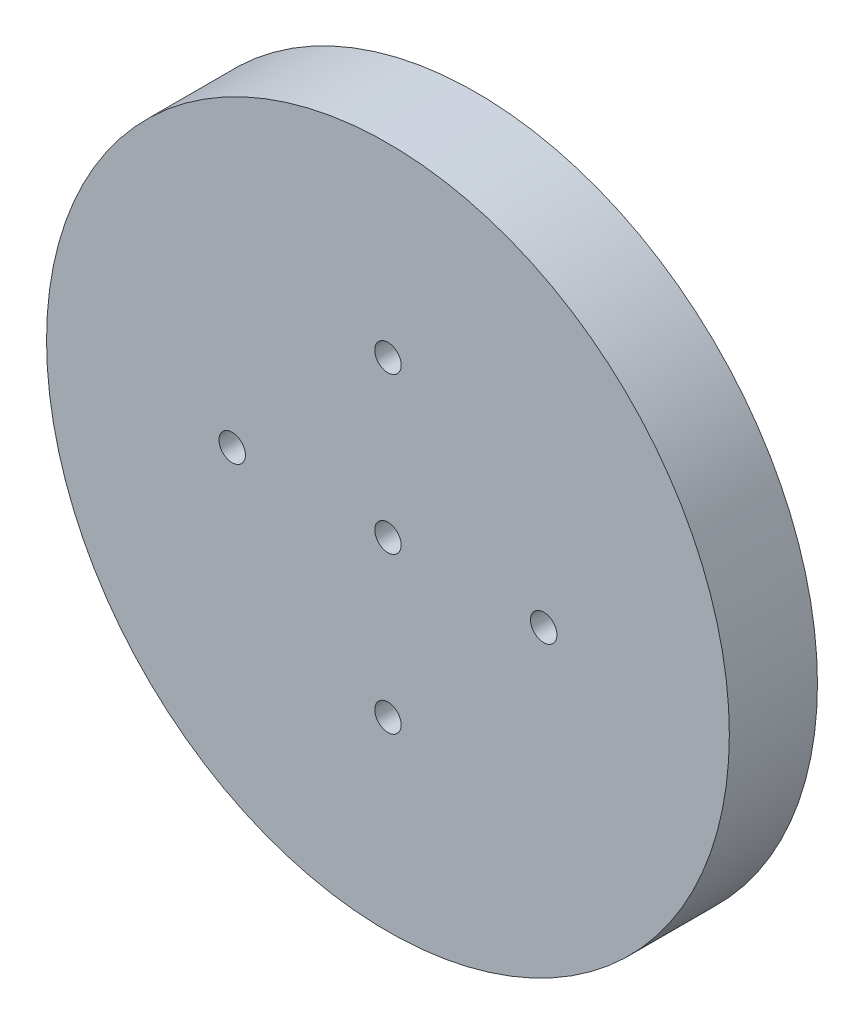
ISO-10303-21;
HEADER;
FILE_DESCRIPTION(('STEP AP214'),'2;1');
FILE_NAME('part.step','',(''),(''),'','','');
FILE_SCHEMA(('AUTOMOTIVE_DESIGN { 1 0 10303 214 1 1 1 1 }'));
ENDSEC;
DATA;
#1=APPLICATION_CONTEXT('core data for automotive mechanical design processes');
#2=APPLICATION_PROTOCOL_DEFINITION('international standard','automotive_design',2000,#1);
#3=PRODUCT_CONTEXT('',#1,'mechanical');
#4=PRODUCT('Part','Part','',(#3));
#5=PRODUCT_RELATED_PRODUCT_CATEGORY('part','',(#4));
#6=PRODUCT_DEFINITION_FORMATION('','',#4);
#7=PRODUCT_DEFINITION_CONTEXT('part definition',#1,'design');
#8=PRODUCT_DEFINITION('design','',#6,#7);
#9=PRODUCT_DEFINITION_SHAPE('','',#8);
#10=(LENGTH_UNIT() NAMED_UNIT(*) SI_UNIT(.MILLI.,.METRE.));
#11=(NAMED_UNIT(*) PLANE_ANGLE_UNIT() SI_UNIT($,.RADIAN.));
#12=(NAMED_UNIT(*) SI_UNIT($,.STERADIAN.) SOLID_ANGLE_UNIT());
#13=UNCERTAINTY_MEASURE_WITH_UNIT(LENGTH_MEASURE(1.E-05),#10,'distance_accuracy_value','');
#14=(GEOMETRIC_REPRESENTATION_CONTEXT(3) GLOBAL_UNCERTAINTY_ASSIGNED_CONTEXT((#13)) GLOBAL_UNIT_ASSIGNED_CONTEXT((#10,
#11,#12)) REPRESENTATION_CONTEXT('',''));
#15=CARTESIAN_POINT('',(0.,0.,0.));
#16=DIRECTION('',(0.,0.,1.));
#17=DIRECTION('',(1.,0.,0.));
#18=AXIS2_PLACEMENT_3D('',#15,#16,#17);
#19=CARTESIAN_POINT('',(0.,0.,10.));
#20=DIRECTION('',(0.,0.,-1.));
#21=DIRECTION('',(-1.,0.,0.));
#22=AXIS2_PLACEMENT_3D('',#19,#20,#21);
#23=CYLINDRICAL_SURFACE('',#22,38.75);
#24=CARTESIAN_POINT('',(0.,0.,10.));
#25=DIRECTION('',(0.,0.,1.));
#26=DIRECTION('',(1.,0.,0.));
#27=AXIS2_PLACEMENT_3D('',#24,#25,#26);
#28=CIRCLE('',#27,38.75);
#29=CARTESIAN_POINT('',(38.75,0.,10.));
#30=VERTEX_POINT('',#29);
#31=EDGE_CURVE('E10',#30,#30,#28,.T.);
#32=ORIENTED_EDGE('',*,*,#31,.F.);
#33=EDGE_LOOP('',(#32));
#34=FACE_BOUND('',#33,.T.);
#35=CARTESIAN_POINT('',(0.,0.,0.));
#36=DIRECTION('',(0.,0.,1.));
#37=DIRECTION('',(1.,0.,0.));
#38=AXIS2_PLACEMENT_3D('',#35,#36,#37);
#39=CIRCLE('',#38,38.75);
#40=CARTESIAN_POINT('',(38.75,0.,0.));
#41=VERTEX_POINT('',#40);
#42=EDGE_CURVE('E46',#41,#41,#39,.T.);
#43=ORIENTED_EDGE('',*,*,#42,.T.);
#44=EDGE_LOOP('',(#43));
#45=FACE_BOUND('',#44,.T.);
#46=ADVANCED_FACE('F38',(#34,#45),#23,.T.);
#47=CARTESIAN_POINT('',(0.,0.,10.));
#48=DIRECTION('',(0.,0.,1.));
#49=DIRECTION('',(1.,0.,0.));
#50=AXIS2_PLACEMENT_3D('',#47,#48,#49);
#51=PLANE('',#50);
#52=CARTESIAN_POINT('',(0.,-17.6776695296638,10.));
#53=DIRECTION('',(0.,0.,1.));
#54=DIRECTION('',(1.,0.,0.));
#55=AXIS2_PLACEMENT_3D('',#52,#53,#54);
#56=CIRCLE('',#55,1.5);
#57=CARTESIAN_POINT('',(1.50000000000001,-17.6776695296638,10.));
#58=VERTEX_POINT('',#57);
#59=EDGE_CURVE('E63',#58,#58,#56,.T.);
#60=ORIENTED_EDGE('',*,*,#59,.F.);
#61=EDGE_LOOP('',(#60));
#62=FACE_BOUND('',#61,.T.);
#63=CARTESIAN_POINT('',(0.,0.,10.));
#64=DIRECTION('',(0.,0.,1.));
#65=DIRECTION('',(1.,0.,0.));
#66=AXIS2_PLACEMENT_3D('',#63,#64,#65);
#67=CIRCLE('',#66,1.5);
#68=CARTESIAN_POINT('',(1.5,0.,10.));
#69=VERTEX_POINT('',#68);
#70=EDGE_CURVE('E166',#69,#69,#67,.T.);
#71=ORIENTED_EDGE('',*,*,#70,.F.);
#72=EDGE_LOOP('',(#71));
#73=FACE_BOUND('',#72,.T.);
#74=CARTESIAN_POINT('',(-17.6776695296638,0.,10.));
#75=DIRECTION('',(0.,0.,1.));
#76=DIRECTION('',(1.,0.,0.));
#77=AXIS2_PLACEMENT_3D('',#74,#75,#76);
#78=CIRCLE('',#77,1.5);
#79=CARTESIAN_POINT('',(-16.1776695296638,0.,10.));
#80=VERTEX_POINT('',#79);
#81=EDGE_CURVE('E162',#80,#80,#78,.T.);
#82=ORIENTED_EDGE('',*,*,#81,.F.);
#83=EDGE_LOOP('',(#82));
#84=FACE_BOUND('',#83,.T.);
#85=CARTESIAN_POINT('',(0.,17.6776695296637,10.));
#86=DIRECTION('',(0.,0.,1.));
#87=DIRECTION('',(1.,0.,0.));
#88=AXIS2_PLACEMENT_3D('',#85,#86,#87);
#89=CIRCLE('',#88,1.5);
#90=CARTESIAN_POINT('',(1.50000000000001,17.6776695296637,10.));
#91=VERTEX_POINT('',#90);
#92=EDGE_CURVE('E159',#91,#91,#89,.T.);
#93=ORIENTED_EDGE('',*,*,#92,.F.);
#94=EDGE_LOOP('',(#93));
#95=FACE_BOUND('',#94,.T.);
#96=CARTESIAN_POINT('',(17.6776695296637,0.,10.));
#97=DIRECTION('',(0.,0.,1.));
#98=DIRECTION('',(1.,0.,0.));
#99=AXIS2_PLACEMENT_3D('',#96,#97,#98);
#100=CIRCLE('',#99,1.5);
#101=CARTESIAN_POINT('',(19.1776695296637,0.,10.));
#102=VERTEX_POINT('',#101);
#103=EDGE_CURVE('E155',#102,#102,#100,.T.);
#104=ORIENTED_EDGE('',*,*,#103,.F.);
#105=EDGE_LOOP('',(#104));
#106=FACE_BOUND('',#105,.T.);
#107=ORIENTED_EDGE('',*,*,#31,.T.);
#108=EDGE_LOOP('',(#107));
#109=FACE_BOUND('',#108,.T.);
#110=ADVANCED_FACE('F103',(#62,#73,#84,#95,#106,#109),#51,.T.);
#111=CARTESIAN_POINT('',(0.,0.,0.));
#112=DIRECTION('',(0.,0.,1.));
#113=DIRECTION('',(1.,0.,0.));
#114=AXIS2_PLACEMENT_3D('',#111,#112,#113);
#115=PLANE('',#114);
#116=CARTESIAN_POINT('',(0.,0.,0.));
#117=DIRECTION('',(0.,0.,-1.));
#118=DIRECTION('',(-1.,0.,0.));
#119=AXIS2_PLACEMENT_3D('',#116,#117,#118);
#120=CIRCLE('',#119,37.);
#121=CARTESIAN_POINT('',(-37.,0.,0.));
#122=VERTEX_POINT('',#121);
#123=EDGE_CURVE('E55',#122,#122,#120,.T.);
#124=ORIENTED_EDGE('',*,*,#123,.F.);
#125=EDGE_LOOP('',(#124));
#126=FACE_BOUND('',#125,.T.);
#127=ORIENTED_EDGE('',*,*,#42,.F.);
#128=EDGE_LOOP('',(#127));
#129=FACE_BOUND('',#128,.T.);
#130=ADVANCED_FACE('F100',(#126,#129),#115,.F.);
#131=CARTESIAN_POINT('',(0.,0.,6.99999999999999));
#132=DIRECTION('',(0.,0.,-1.));
#133=DIRECTION('',(-1.,0.,0.));
#134=AXIS2_PLACEMENT_3D('',#131,#132,#133);
#135=CYLINDRICAL_SURFACE('',#134,37.);
#136=CARTESIAN_POINT('',(0.,0.,6.99999999999999));
#137=DIRECTION('',(0.,0.,-1.));
#138=DIRECTION('',(-1.,0.,0.));
#139=AXIS2_PLACEMENT_3D('',#136,#137,#138);
#140=CIRCLE('',#139,37.);
#141=CARTESIAN_POINT('',(-37.,0.,6.99999999999999));
#142=VERTEX_POINT('',#141);
#143=EDGE_CURVE('E52',#142,#142,#140,.T.);
#144=ORIENTED_EDGE('',*,*,#143,.F.);
#145=EDGE_LOOP('',(#144));
#146=FACE_BOUND('',#145,.T.);
#147=ORIENTED_EDGE('',*,*,#123,.T.);
#148=EDGE_LOOP('',(#147));
#149=FACE_BOUND('',#148,.T.);
#150=ADVANCED_FACE('F98',(#146,#149),#135,.F.);
#151=CARTESIAN_POINT('',(0.,0.,6.99999999999999));
#152=DIRECTION('',(0.,0.,-1.));
#153=DIRECTION('',(-1.,0.,0.));
#154=AXIS2_PLACEMENT_3D('',#151,#152,#153);
#155=PLANE('',#154);
#156=CARTESIAN_POINT('',(0.,-17.6776695296638,6.99999999999999));
#157=DIRECTION('',(0.,0.,-1.));
#158=DIRECTION('',(-1.,0.,0.));
#159=AXIS2_PLACEMENT_3D('',#156,#157,#158);
#160=CIRCLE('',#159,1.5);
#161=CARTESIAN_POINT('',(-1.49999999999999,-17.6776695296638,6.99999999999999));
#162=VERTEX_POINT('',#161);
#163=EDGE_CURVE('E41',#162,#162,#160,.T.);
#164=ORIENTED_EDGE('',*,*,#163,.F.);
#165=EDGE_LOOP('',(#164));
#166=FACE_BOUND('',#165,.T.);
#167=CARTESIAN_POINT('',(-17.6776695296638,0.,6.99999999999999));
#168=DIRECTION('',(0.,0.,-1.));
#169=DIRECTION('',(-1.,0.,0.));
#170=AXIS2_PLACEMENT_3D('',#167,#168,#169);
#171=CIRCLE('',#170,1.5);
#172=CARTESIAN_POINT('',(-19.1776695296638,0.,6.99999999999999));
#173=VERTEX_POINT('',#172);
#174=EDGE_CURVE('E70',#173,#173,#171,.T.);
#175=ORIENTED_EDGE('',*,*,#174,.F.);
#176=EDGE_LOOP('',(#175));
#177=FACE_BOUND('',#176,.T.);
#178=CARTESIAN_POINT('',(0.,17.6776695296637,6.99999999999999));
#179=DIRECTION('',(0.,0.,-1.));
#180=DIRECTION('',(-1.,0.,0.));
#181=AXIS2_PLACEMENT_3D('',#178,#179,#180);
#182=CIRCLE('',#181,1.5);
#183=CARTESIAN_POINT('',(-1.5,17.6776695296637,6.99999999999999));
#184=VERTEX_POINT('',#183);
#185=EDGE_CURVE('E67',#184,#184,#182,.T.);
#186=ORIENTED_EDGE('',*,*,#185,.F.);
#187=EDGE_LOOP('',(#186));
#188=FACE_BOUND('',#187,.T.);
#189=CARTESIAN_POINT('',(17.6776695296637,0.,6.99999999999999));
#190=DIRECTION('',(0.,0.,-1.));
#191=DIRECTION('',(-1.,0.,0.));
#192=AXIS2_PLACEMENT_3D('',#189,#190,#191);
#193=CIRCLE('',#192,1.5);
#194=CARTESIAN_POINT('',(16.1776695296637,0.,6.99999999999999));
#195=VERTEX_POINT('',#194);
#196=EDGE_CURVE('E62',#195,#195,#193,.T.);
#197=ORIENTED_EDGE('',*,*,#196,.F.);
#198=EDGE_LOOP('',(#197));
#199=FACE_BOUND('',#198,.T.);
#200=CARTESIAN_POINT('',(0.,0.,6.99999999999999));
#201=DIRECTION('',(0.,0.,-1.));
#202=DIRECTION('',(-1.,0.,0.));
#203=AXIS2_PLACEMENT_3D('',#200,#201,#202);
#204=CIRCLE('',#203,10.);
#205=CARTESIAN_POINT('',(-10.,0.,6.99999999999999));
#206=VERTEX_POINT('',#205);
#207=EDGE_CURVE('E77',#206,#206,#204,.T.);
#208=ORIENTED_EDGE('',*,*,#207,.F.);
#209=EDGE_LOOP('',(#208));
#210=FACE_BOUND('',#209,.T.);
#211=ORIENTED_EDGE('',*,*,#143,.T.);
#212=EDGE_LOOP('',(#211));
#213=FACE_BOUND('',#212,.T.);
#214=ADVANCED_FACE('F120',(#166,#177,#188,#199,#210,#213),#155,.T.);
#215=CARTESIAN_POINT('',(0.,0.,5.99999999999999));
#216=DIRECTION('',(0.,0.,1.));
#217=DIRECTION('',(1.,0.,0.));
#218=AXIS2_PLACEMENT_3D('',#215,#216,#217);
#219=CYLINDRICAL_SURFACE('',#218,10.);
#220=CARTESIAN_POINT('',(0.,0.,5.99999999999999));
#221=DIRECTION('',(0.,0.,-1.));
#222=DIRECTION('',(-1.,0.,0.));
#223=AXIS2_PLACEMENT_3D('',#220,#221,#222);
#224=CIRCLE('',#223,10.);
#225=CARTESIAN_POINT('',(-10.,0.,5.99999999999999));
#226=VERTEX_POINT('',#225);
#227=EDGE_CURVE('E82',#226,#226,#224,.T.);
#228=ORIENTED_EDGE('',*,*,#227,.F.);
#229=EDGE_LOOP('',(#228));
#230=FACE_BOUND('',#229,.T.);
#231=ORIENTED_EDGE('',*,*,#207,.T.);
#232=EDGE_LOOP('',(#231));
#233=FACE_BOUND('',#232,.T.);
#234=ADVANCED_FACE('F124',(#230,#233),#219,.T.);
#235=CARTESIAN_POINT('',(0.,0.,5.99999999999999));
#236=DIRECTION('',(0.,0.,-1.));
#237=DIRECTION('',(-1.,0.,0.));
#238=AXIS2_PLACEMENT_3D('',#235,#236,#237);
#239=PLANE('',#238);
#240=CARTESIAN_POINT('',(0.,0.,5.99999999999999));
#241=DIRECTION('',(0.,0.,-1.));
#242=DIRECTION('',(-1.,0.,0.));
#243=AXIS2_PLACEMENT_3D('',#240,#241,#242);
#244=CIRCLE('',#243,1.5);
#245=CARTESIAN_POINT('',(-1.5,0.,5.99999999999999));
#246=VERTEX_POINT('',#245);
#247=EDGE_CURVE('E58',#246,#246,#244,.T.);
#248=ORIENTED_EDGE('',*,*,#247,.F.);
#249=EDGE_LOOP('',(#248));
#250=FACE_BOUND('',#249,.T.);
#251=ORIENTED_EDGE('',*,*,#227,.T.);
#252=EDGE_LOOP('',(#251));
#253=FACE_BOUND('',#252,.T.);
#254=ADVANCED_FACE('F128',(#250,#253),#239,.T.);
#255=CARTESIAN_POINT('',(0.,0.,0.));
#256=DIRECTION('',(0.,0.,1.));
#257=DIRECTION('',(1.,0.,0.));
#258=AXIS2_PLACEMENT_3D('',#255,#256,#257);
#259=CYLINDRICAL_SURFACE('',#258,1.5);
#260=ORIENTED_EDGE('',*,*,#247,.T.);
#261=EDGE_LOOP('',(#260));
#262=FACE_BOUND('',#261,.T.);
#263=ORIENTED_EDGE('',*,*,#70,.T.);
#264=EDGE_LOOP('',(#263));
#265=FACE_BOUND('',#264,.T.);
#266=ADVANCED_FACE('F132',(#262,#265),#259,.F.);
#267=CARTESIAN_POINT('',(17.6776695296637,0.,0.));
#268=DIRECTION('',(0.,0.,1.));
#269=DIRECTION('',(1.,0.,0.));
#270=AXIS2_PLACEMENT_3D('',#267,#268,#269);
#271=CYLINDRICAL_SURFACE('',#270,1.5);
#272=ORIENTED_EDGE('',*,*,#196,.T.);
#273=EDGE_LOOP('',(#272));
#274=FACE_BOUND('',#273,.T.);
#275=ORIENTED_EDGE('',*,*,#103,.T.);
#276=EDGE_LOOP('',(#275));
#277=FACE_BOUND('',#276,.T.);
#278=ADVANCED_FACE('F138',(#274,#277),#271,.F.);
#279=CARTESIAN_POINT('',(0.,17.6776695296637,0.));
#280=DIRECTION('',(0.,0.,1.));
#281=DIRECTION('',(1.,0.,0.));
#282=AXIS2_PLACEMENT_3D('',#279,#280,#281);
#283=CYLINDRICAL_SURFACE('',#282,1.5);
#284=ORIENTED_EDGE('',*,*,#185,.T.);
#285=EDGE_LOOP('',(#284));
#286=FACE_BOUND('',#285,.T.);
#287=ORIENTED_EDGE('',*,*,#92,.T.);
#288=EDGE_LOOP('',(#287));
#289=FACE_BOUND('',#288,.T.);
#290=ADVANCED_FACE('F134',(#286,#289),#283,.F.);
#291=CARTESIAN_POINT('',(-17.6776695296638,0.,0.));
#292=DIRECTION('',(0.,0.,1.));
#293=DIRECTION('',(1.,0.,0.));
#294=AXIS2_PLACEMENT_3D('',#291,#292,#293);
#295=CYLINDRICAL_SURFACE('',#294,1.5);
#296=ORIENTED_EDGE('',*,*,#174,.T.);
#297=EDGE_LOOP('',(#296));
#298=FACE_BOUND('',#297,.T.);
#299=ORIENTED_EDGE('',*,*,#81,.T.);
#300=EDGE_LOOP('',(#299));
#301=FACE_BOUND('',#300,.T.);
#302=ADVANCED_FACE('F137',(#298,#301),#295,.F.);
#303=CARTESIAN_POINT('',(0.,-17.6776695296638,0.));
#304=DIRECTION('',(0.,0.,1.));
#305=DIRECTION('',(1.,0.,0.));
#306=AXIS2_PLACEMENT_3D('',#303,#304,#305);
#307=CYLINDRICAL_SURFACE('',#306,1.5);
#308=ORIENTED_EDGE('',*,*,#163,.T.);
#309=EDGE_LOOP('',(#308));
#310=FACE_BOUND('',#309,.T.);
#311=ORIENTED_EDGE('',*,*,#59,.T.);
#312=EDGE_LOOP('',(#311));
#313=FACE_BOUND('',#312,.T.);
#314=ADVANCED_FACE('F148',(#310,#313),#307,.F.);
#315=CLOSED_SHELL('',(#46,#110,#130,#150,#214,#234,#254,#266,#278,#290,#302,#314));
#316=MANIFOLD_SOLID_BREP('B2',#315);
#317=ADVANCED_BREP_SHAPE_REPRESENTATION('',(#18,#316),#14);
#318=SHAPE_DEFINITION_REPRESENTATION(#9,#317);
ENDSEC;
END-ISO-10303-21;
